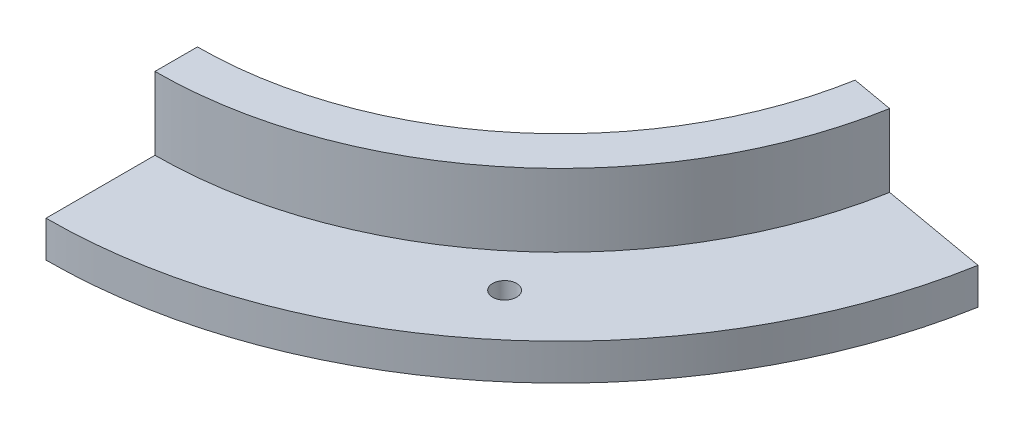
ISO-10303-21;
HEADER;
FILE_DESCRIPTION(('STEP AP214'),'2;1');
FILE_NAME('part.step','',(''),(''),'','','');
FILE_SCHEMA(('AUTOMOTIVE_DESIGN { 1 0 10303 214 1 1 1 1 }'));
ENDSEC;
DATA;
#1=APPLICATION_CONTEXT('core data for automotive mechanical design processes');
#2=APPLICATION_PROTOCOL_DEFINITION('international standard','automotive_design',2000,#1);
#3=PRODUCT_CONTEXT('',#1,'mechanical');
#4=PRODUCT('Part','Part','',(#3));
#5=PRODUCT_RELATED_PRODUCT_CATEGORY('part','',(#4));
#6=PRODUCT_DEFINITION_FORMATION('','',#4);
#7=PRODUCT_DEFINITION_CONTEXT('part definition',#1,'design');
#8=PRODUCT_DEFINITION('design','',#6,#7);
#9=PRODUCT_DEFINITION_SHAPE('','',#8);
#10=(LENGTH_UNIT() NAMED_UNIT(*) SI_UNIT(.MILLI.,.METRE.));
#11=(NAMED_UNIT(*) PLANE_ANGLE_UNIT() SI_UNIT($,.RADIAN.));
#12=(NAMED_UNIT(*) SI_UNIT($,.STERADIAN.) SOLID_ANGLE_UNIT());
#13=UNCERTAINTY_MEASURE_WITH_UNIT(LENGTH_MEASURE(1.E-05),#10,'distance_accuracy_value','');
#14=(GEOMETRIC_REPRESENTATION_CONTEXT(3) GLOBAL_UNCERTAINTY_ASSIGNED_CONTEXT((#13)) GLOBAL_UNIT_ASSIGNED_CONTEXT((#10,
#11,#12)) REPRESENTATION_CONTEXT('',''));
#15=CARTESIAN_POINT('',(0.,0.,0.));
#16=DIRECTION('',(0.,0.,1.));
#17=DIRECTION('',(1.,0.,0.));
#18=AXIS2_PLACEMENT_3D('',#15,#16,#17);
#19=CARTESIAN_POINT('',(0.,20.,0.));
#20=DIRECTION('',(0.,-1.,0.));
#21=DIRECTION('',(0.,0.,-1.));
#22=AXIS2_PLACEMENT_3D('',#19,#20,#21);
#23=CYLINDRICAL_SURFACE('',#22,141.7);
#24=CARTESIAN_POINT('',(0.,10.,0.));
#25=DIRECTION('',(0.,1.,0.));
#26=DIRECTION('',(0.,0.,1.));
#27=AXIS2_PLACEMENT_3D('',#24,#25,#26);
#28=CIRCLE('',#27,141.7);
#29=CARTESIAN_POINT('',(0.,10.,141.7));
#30=VERTEX_POINT('',#29);
#31=CARTESIAN_POINT('',(139.54725860183,10.,24.6059467754036));
#32=VERTEX_POINT('',#31);
#33=EDGE_CURVE('E121',#30,#32,#28,.T.);
#34=ORIENTED_EDGE('',*,*,#33,.F.);
#35=DIRECTION('',(0.,-1.,0.));
#36=VECTOR('',#35,1.);
#37=CARTESIAN_POINT('',(0.,20.,141.7));
#38=LINE('',#37,#36);
#39=CARTESIAN_POINT('',(0.,0.,141.7));
#40=VERTEX_POINT('',#39);
#41=EDGE_CURVE('E52',#30,#40,#38,.T.);
#42=ORIENTED_EDGE('',*,*,#41,.T.);
#43=CARTESIAN_POINT('',(0.,0.,0.));
#44=DIRECTION('',(0.,1.,0.));
#45=DIRECTION('',(0.,0.,1.));
#46=AXIS2_PLACEMENT_3D('',#43,#44,#45);
#47=CIRCLE('',#46,141.7);
#48=CARTESIAN_POINT('',(139.54725860183,0.,24.6059467754036));
#49=VERTEX_POINT('',#48);
#50=EDGE_CURVE('E143',#40,#49,#47,.T.);
#51=ORIENTED_EDGE('',*,*,#50,.T.);
#52=DIRECTION('',(0.,-1.,0.));
#53=VECTOR('',#52,1.);
#54=CARTESIAN_POINT('',(139.54725860183,20.,24.6059467754036));
#55=LINE('',#54,#53);
#56=EDGE_CURVE('E137',#32,#49,#55,.T.);
#57=ORIENTED_EDGE('',*,*,#56,.F.);
#58=EDGE_LOOP('',(#34,#42,#51,#57));
#59=FACE_BOUND('',#58,.T.);
#60=ADVANCED_FACE('F43',(#59),#23,.T.);
#61=CARTESIAN_POINT('',(0.,20.,0.));
#62=DIRECTION('',(0.,1.,0.));
#63=DIRECTION('',(0.,0.,1.));
#64=AXIS2_PLACEMENT_3D('',#61,#62,#63);
#65=PLANE('',#64);
#66=CARTESIAN_POINT('',(0.,20.,0.));
#67=DIRECTION('',(0.,-1.,0.));
#68=DIRECTION('',(0.,0.,1.));
#69=AXIS2_PLACEMENT_3D('',#66,#67,#68);
#70=CIRCLE('',#69,100.);
#71=CARTESIAN_POINT('',(98.4807753012209,20.,17.3648177666927));
#72=VERTEX_POINT('',#71);
#73=CARTESIAN_POINT('',(0.,20.,100.));
#74=VERTEX_POINT('',#73);
#75=EDGE_CURVE('E67',#72,#74,#70,.T.);
#76=ORIENTED_EDGE('',*,*,#75,.F.);
#77=DIRECTION('',(-0.984807753012209,0.,-0.173648177666927));
#78=VECTOR('',#77,1.);
#79=CARTESIAN_POINT('',(90.3068709512195,20.,15.9235378920572));
#80=LINE('',#79,#78);
#81=CARTESIAN_POINT('',(90.3068709512195,20.,15.9235378920572));
#82=VERTEX_POINT('',#81);
#83=EDGE_CURVE('E188',#72,#82,#80,.T.);
#84=ORIENTED_EDGE('',*,*,#83,.T.);
#85=CARTESIAN_POINT('',(0.,20.,0.));
#86=DIRECTION('',(0.,-1.,0.));
#87=DIRECTION('',(0.,0.,1.));
#88=AXIS2_PLACEMENT_3D('',#85,#86,#87);
#89=CIRCLE('',#88,91.7);
#90=CARTESIAN_POINT('',(66.2525360181307,20.,63.3994595494812));
#91=VERTEX_POINT('',#90);
#92=EDGE_CURVE('E185',#82,#91,#89,.T.);
#93=ORIENTED_EDGE('',*,*,#92,.T.);
#94=DIRECTION('',(-0.766044443118982,0.,0.642787609686535));
#95=VECTOR('',#94,1.);
#96=CARTESIAN_POINT('',(50.9316471557511,20.,76.2552117432119));
#97=LINE('',#96,#95);
#98=CARTESIAN_POINT('',(50.9316471557511,20.,76.2552117432119));
#99=VERTEX_POINT('',#98);
#100=EDGE_CURVE('E161',#91,#99,#97,.T.);
#101=ORIENTED_EDGE('',*,*,#100,.T.);
#102=CARTESIAN_POINT('',(0.,20.,0.));
#103=DIRECTION('',(0.,-1.,0.));
#104=DIRECTION('',(0.,0.,1.));
#105=AXIS2_PLACEMENT_3D('',#102,#103,#104);
#106=CIRCLE('',#105,91.7);
#107=CARTESIAN_POINT('',(0.,20.,91.7));
#108=VERTEX_POINT('',#107);
#109=EDGE_CURVE('E165',#99,#108,#106,.T.);
#110=ORIENTED_EDGE('',*,*,#109,.T.);
#111=DIRECTION('',(0.,0.,1.));
#112=VECTOR('',#111,1.);
#113=CARTESIAN_POINT('',(0.,20.,91.7));
#114=LINE('',#113,#112);
#115=EDGE_CURVE('E191',#108,#74,#114,.T.);
#116=ORIENTED_EDGE('',*,*,#115,.T.);
#117=EDGE_LOOP('',(#76,#84,#93,#101,#110,#116));
#118=FACE_BOUND('',#117,.T.);
#119=ADVANCED_FACE('F260',(#118),#65,.T.);
#120=CARTESIAN_POINT('',(0.,20.,0.));
#121=DIRECTION('',(0.,-1.,0.));
#122=DIRECTION('',(0.,0.,-1.));
#123=AXIS2_PLACEMENT_3D('',#120,#121,#122);
#124=CYLINDRICAL_SURFACE('',#123,91.7);
#125=CARTESIAN_POINT('',(0.,0.,0.));
#126=DIRECTION('',(0.,-1.,0.));
#127=DIRECTION('',(0.,0.,1.));
#128=AXIS2_PLACEMENT_3D('',#125,#126,#127);
#129=CIRCLE('',#128,91.7);
#130=CARTESIAN_POINT('',(50.9316471557511,0.,76.2552117432119));
#131=VERTEX_POINT('',#130);
#132=CARTESIAN_POINT('',(0.,0.,91.7));
#133=VERTEX_POINT('',#132);
#134=EDGE_CURVE('E178',#131,#133,#129,.T.);
#135=ORIENTED_EDGE('',*,*,#134,.T.);
#136=DIRECTION('',(0.,-1.,0.));
#137=VECTOR('',#136,1.);
#138=CARTESIAN_POINT('',(0.,20.,91.7));
#139=LINE('',#138,#137);
#140=EDGE_CURVE('E11',#108,#133,#139,.T.);
#141=ORIENTED_EDGE('',*,*,#140,.F.);
#142=ORIENTED_EDGE('',*,*,#109,.F.);
#143=DIRECTION('',(0.,-1.,0.));
#144=VECTOR('',#143,1.);
#145=CARTESIAN_POINT('',(50.9316471557511,20.,76.2552117432119));
#146=LINE('',#145,#144);
#147=EDGE_CURVE('E157',#99,#131,#146,.T.);
#148=ORIENTED_EDGE('',*,*,#147,.T.);
#149=EDGE_LOOP('',(#135,#141,#142,#148));
#150=FACE_BOUND('',#149,.T.);
#151=ADVANCED_FACE('F45',(#150),#124,.F.);
#152=CARTESIAN_POINT('',(0.,20.,91.7));
#153=DIRECTION('',(1.,0.,0.));
#154=DIRECTION('',(0.,0.,-1.));
#155=AXIS2_PLACEMENT_3D('',#152,#153,#154);
#156=PLANE('',#155);
#157=DIRECTION('',(0.,0.,1.));
#158=VECTOR('',#157,1.);
#159=CARTESIAN_POINT('',(0.,10.,141.7));
#160=LINE('',#159,#158);
#161=CARTESIAN_POINT('',(0.,10.,111.7));
#162=VERTEX_POINT('',#161);
#163=EDGE_CURVE('E127',#162,#30,#160,.T.);
#164=ORIENTED_EDGE('',*,*,#163,.F.);
#165=DIRECTION('',(0.,1.,0.));
#166=VECTOR('',#165,1.);
#167=CARTESIAN_POINT('',(0.,10.,111.7));
#168=LINE('',#167,#166);
#169=CARTESIAN_POINT('',(0.,30.,111.7));
#170=VERTEX_POINT('',#169);
#171=EDGE_CURVE('E222',#162,#170,#168,.T.);
#172=ORIENTED_EDGE('',*,*,#171,.T.);
#173=DIRECTION('',(0.,0.,1.));
#174=VECTOR('',#173,1.);
#175=CARTESIAN_POINT('',(0.,30.,100.));
#176=LINE('',#175,#174);
#177=CARTESIAN_POINT('',(0.,30.,100.));
#178=VERTEX_POINT('',#177);
#179=EDGE_CURVE('E211',#178,#170,#176,.T.);
#180=ORIENTED_EDGE('',*,*,#179,.F.);
#181=DIRECTION('',(0.,-1.,0.));
#182=VECTOR('',#181,1.);
#183=CARTESIAN_POINT('',(0.,30.,100.));
#184=LINE('',#183,#182);
#185=EDGE_CURVE('E182',#178,#74,#184,.T.);
#186=ORIENTED_EDGE('',*,*,#185,.T.);
#187=ORIENTED_EDGE('',*,*,#115,.F.);
#188=ORIENTED_EDGE('',*,*,#140,.T.);
#189=DIRECTION('',(0.,0.,1.));
#190=VECTOR('',#189,1.);
#191=CARTESIAN_POINT('',(0.,0.,91.7));
#192=LINE('',#191,#190);
#193=EDGE_CURVE('E174',#133,#40,#192,.T.);
#194=ORIENTED_EDGE('',*,*,#193,.T.);
#195=ORIENTED_EDGE('',*,*,#41,.F.);
#196=EDGE_LOOP('',(#164,#172,#180,#186,#187,#188,#194,#195));
#197=FACE_BOUND('',#196,.T.);
#198=ADVANCED_FACE('F268',(#197),#156,.F.);
#199=CARTESIAN_POINT('',(90.3068709512195,20.,15.9235378920572));
#200=DIRECTION('',(-0.173648177666927,0.,0.984807753012209));
#201=DIRECTION('',(0.984807753012209,0.,0.173648177666927));
#202=AXIS2_PLACEMENT_3D('',#199,#200,#201);
#203=PLANE('',#202);
#204=DIRECTION('',(-0.984807753012209,0.,-0.173648177666927));
#205=VECTOR('',#204,1.);
#206=CARTESIAN_POINT('',(98.4807753012209,30.,17.3648177666927));
#207=LINE('',#206,#205);
#208=CARTESIAN_POINT('',(110.003026011464,30.,19.3965014453958));
#209=VERTEX_POINT('',#208);
#210=CARTESIAN_POINT('',(98.4807753012209,30.,17.3648177666927));
#211=VERTEX_POINT('',#210);
#212=EDGE_CURVE('E204',#209,#211,#207,.T.);
#213=ORIENTED_EDGE('',*,*,#212,.F.);
#214=DIRECTION('',(0.,1.,0.));
#215=VECTOR('',#214,1.);
#216=CARTESIAN_POINT('',(110.003026011464,10.,19.3965014453958));
#217=LINE('',#216,#215);
#218=CARTESIAN_POINT('',(110.003026011464,10.,19.3965014453958));
#219=VERTEX_POINT('',#218);
#220=EDGE_CURVE('E59',#219,#209,#217,.T.);
#221=ORIENTED_EDGE('',*,*,#220,.F.);
#222=DIRECTION('',(-0.984807753012208,0.,-0.173648177666927));
#223=VECTOR('',#222,1.);
#224=CARTESIAN_POINT('',(139.54725860183,10.,24.6059467754036));
#225=LINE('',#224,#223);
#226=EDGE_CURVE('E125',#32,#219,#225,.T.);
#227=ORIENTED_EDGE('',*,*,#226,.F.);
#228=ORIENTED_EDGE('',*,*,#56,.T.);
#229=DIRECTION('',(-0.984807753012209,0.,-0.173648177666927));
#230=VECTOR('',#229,1.);
#231=CARTESIAN_POINT('',(90.3068709512195,0.,15.9235378920572));
#232=LINE('',#231,#230);
#233=CARTESIAN_POINT('',(90.3068709512195,0.,15.9235378920572));
#234=VERTEX_POINT('',#233);
#235=EDGE_CURVE('E169',#49,#234,#232,.T.);
#236=ORIENTED_EDGE('',*,*,#235,.T.);
#237=DIRECTION('',(0.,-1.,0.));
#238=VECTOR('',#237,1.);
#239=CARTESIAN_POINT('',(90.3068709512195,20.,15.9235378920572));
#240=LINE('',#239,#238);
#241=EDGE_CURVE('E146',#82,#234,#240,.T.);
#242=ORIENTED_EDGE('',*,*,#241,.F.);
#243=ORIENTED_EDGE('',*,*,#83,.F.);
#244=DIRECTION('',(0.,-1.,0.));
#245=VECTOR('',#244,1.);
#246=CARTESIAN_POINT('',(98.4807753012209,30.,17.3648177666927));
#247=LINE('',#246,#245);
#248=EDGE_CURVE('E200',#211,#72,#247,.T.);
#249=ORIENTED_EDGE('',*,*,#248,.F.);
#250=EDGE_LOOP('',(#213,#221,#227,#228,#236,#242,#243,#249));
#251=FACE_BOUND('',#250,.T.);
#252=ADVANCED_FACE('F136',(#251),#203,.F.);
#253=CARTESIAN_POINT('',(0.,20.,0.));
#254=DIRECTION('',(0.,-1.,0.));
#255=DIRECTION('',(0.,0.,-1.));
#256=AXIS2_PLACEMENT_3D('',#253,#254,#255);
#257=CYLINDRICAL_SURFACE('',#256,91.7);
#258=CARTESIAN_POINT('',(0.,0.,0.));
#259=DIRECTION('',(0.,-1.,0.));
#260=DIRECTION('',(0.,0.,1.));
#261=AXIS2_PLACEMENT_3D('',#258,#259,#260);
#262=CIRCLE('',#261,91.7);
#263=CARTESIAN_POINT('',(66.2525360181307,0.,63.3994595494812));
#264=VERTEX_POINT('',#263);
#265=EDGE_CURVE('E166',#234,#264,#262,.T.);
#266=ORIENTED_EDGE('',*,*,#265,.T.);
#267=DIRECTION('',(0.,-1.,0.));
#268=VECTOR('',#267,1.);
#269=CARTESIAN_POINT('',(66.2525360181307,20.,63.3994595494812));
#270=LINE('',#269,#268);
#271=EDGE_CURVE('E151',#91,#264,#270,.T.);
#272=ORIENTED_EDGE('',*,*,#271,.F.);
#273=ORIENTED_EDGE('',*,*,#92,.F.);
#274=ORIENTED_EDGE('',*,*,#241,.T.);
#275=EDGE_LOOP('',(#266,#272,#273,#274));
#276=FACE_BOUND('',#275,.T.);
#277=ADVANCED_FACE('F275',(#276),#257,.F.);
#278=CARTESIAN_POINT('',(50.9316471557511,20.,76.2552117432119));
#279=DIRECTION('',(0.642787609686535,0.,0.766044443118982));
#280=DIRECTION('',(0.766044443118982,0.,-0.642787609686535));
#281=AXIS2_PLACEMENT_3D('',#278,#279,#280);
#282=PLANE('',#281);
#283=CARTESIAN_POINT('',(58.5920915869409,10.,69.8273356463466));
#284=DIRECTION('',(-0.642787609686535,0.,-0.766044443118982));
#285=DIRECTION('',(-0.766044443118982,0.,0.642787609686535));
#286=AXIS2_PLACEMENT_3D('',#283,#284,#285);
#287=CIRCLE('',#286,2.8);
#288=CARTESIAN_POINT('',(56.4471671462078,10.,71.6271409534689));
#289=VERTEX_POINT('',#288);
#290=EDGE_CURVE('E218',#289,#289,#287,.T.);
#291=ORIENTED_EDGE('',*,*,#290,.F.);
#292=EDGE_LOOP('',(#291));
#293=FACE_BOUND('',#292,.T.);
#294=DIRECTION('',(-0.766044443118982,0.,0.642787609686535));
#295=VECTOR('',#294,1.);
#296=CARTESIAN_POINT('',(50.9316471557511,0.,76.2552117432119));
#297=LINE('',#296,#295);
#298=EDGE_CURVE('E162',#264,#131,#297,.T.);
#299=ORIENTED_EDGE('',*,*,#298,.T.);
#300=ORIENTED_EDGE('',*,*,#147,.F.);
#301=ORIENTED_EDGE('',*,*,#100,.F.);
#302=ORIENTED_EDGE('',*,*,#271,.T.);
#303=EDGE_LOOP('',(#299,#300,#301,#302));
#304=FACE_BOUND('',#303,.T.);
#305=ADVANCED_FACE('F298',(#293,#304),#282,.F.);
#306=CARTESIAN_POINT('',(0.,0.,0.));
#307=DIRECTION('',(0.,1.,0.));
#308=DIRECTION('',(0.,0.,1.));
#309=AXIS2_PLACEMENT_3D('',#306,#307,#308);
#310=PLANE('',#309);
#311=CARTESIAN_POINT('',(80.3484512108169,0.,95.7555553898727));
#312=DIRECTION('',(0.,1.,0.));
#313=DIRECTION('',(0.,0.,1.));
#314=AXIS2_PLACEMENT_3D('',#311,#312,#313);
#315=CIRCLE('',#314,3.3);
#316=CARTESIAN_POINT('',(80.3484512108169,0.,99.0555553898727));
#317=VERTEX_POINT('',#316);
#318=EDGE_CURVE('E233',#317,#317,#315,.T.);
#319=ORIENTED_EDGE('',*,*,#318,.T.);
#320=EDGE_LOOP('',(#319));
#321=FACE_BOUND('',#320,.T.);
#322=ORIENTED_EDGE('',*,*,#134,.F.);
#323=ORIENTED_EDGE('',*,*,#298,.F.);
#324=ORIENTED_EDGE('',*,*,#265,.F.);
#325=ORIENTED_EDGE('',*,*,#235,.F.);
#326=ORIENTED_EDGE('',*,*,#50,.F.);
#327=ORIENTED_EDGE('',*,*,#193,.F.);
#328=EDGE_LOOP('',(#322,#323,#324,#325,#326,#327));
#329=FACE_BOUND('',#328,.T.);
#330=ADVANCED_FACE('F280',(#321,#329),#310,.F.);
#331=CARTESIAN_POINT('',(0.,30.,0.));
#332=DIRECTION('',(0.,-1.,0.));
#333=DIRECTION('',(0.,0.,-1.));
#334=AXIS2_PLACEMENT_3D('',#331,#332,#333);
#335=CYLINDRICAL_SURFACE('',#334,100.);
#336=ORIENTED_EDGE('',*,*,#75,.T.);
#337=ORIENTED_EDGE('',*,*,#185,.F.);
#338=CARTESIAN_POINT('',(0.,30.,0.));
#339=DIRECTION('',(0.,-1.,0.));
#340=DIRECTION('',(0.,0.,1.));
#341=AXIS2_PLACEMENT_3D('',#338,#339,#340);
#342=CIRCLE('',#341,100.);
#343=EDGE_CURVE('E207',#211,#178,#342,.T.);
#344=ORIENTED_EDGE('',*,*,#343,.F.);
#345=ORIENTED_EDGE('',*,*,#248,.T.);
#346=EDGE_LOOP('',(#336,#337,#344,#345));
#347=FACE_BOUND('',#346,.T.);
#348=ADVANCED_FACE('F292',(#347),#335,.F.);
#349=CARTESIAN_POINT('',(0.,30.,0.));
#350=DIRECTION('',(0.,1.,0.));
#351=DIRECTION('',(0.,0.,1.));
#352=AXIS2_PLACEMENT_3D('',#349,#350,#351);
#353=PLANE('',#352);
#354=CARTESIAN_POINT('',(0.,30.,0.));
#355=DIRECTION('',(0.,-1.,0.));
#356=DIRECTION('',(0.,0.,1.));
#357=AXIS2_PLACEMENT_3D('',#354,#355,#356);
#358=CIRCLE('',#357,111.7);
#359=EDGE_CURVE('E132',#209,#170,#358,.T.);
#360=ORIENTED_EDGE('',*,*,#359,.F.);
#361=ORIENTED_EDGE('',*,*,#212,.T.);
#362=ORIENTED_EDGE('',*,*,#343,.T.);
#363=ORIENTED_EDGE('',*,*,#179,.T.);
#364=EDGE_LOOP('',(#360,#361,#362,#363));
#365=FACE_BOUND('',#364,.T.);
#366=ADVANCED_FACE('F295',(#365),#353,.T.);
#367=CARTESIAN_POINT('',(60.3918968940632,10.,71.9722600870797));
#368=DIRECTION('',(-0.642787609686535,0.,-0.766044443118982));
#369=DIRECTION('',(-0.766044443118982,0.,0.642787609686535));
#370=AXIS2_PLACEMENT_3D('',#367,#368,#369);
#371=CYLINDRICAL_SURFACE('',#370,2.8);
#372=CARTESIAN_POINT('',(60.3918968940632,10.,71.9722600870797));
#373=DIRECTION('',(-0.642787609686535,0.,-0.766044443118982));
#374=DIRECTION('',(-0.766044443118982,0.,0.642787609686535));
#375=AXIS2_PLACEMENT_3D('',#372,#373,#374);
#376=CIRCLE('',#375,2.8);
#377=CARTESIAN_POINT('',(58.2469724533301,10.,73.772065394202));
#378=VERTEX_POINT('',#377);
#379=EDGE_CURVE('E208',#378,#378,#376,.T.);
#380=ORIENTED_EDGE('',*,*,#379,.F.);
#381=EDGE_LOOP('',(#380));
#382=FACE_BOUND('',#381,.T.);
#383=ORIENTED_EDGE('',*,*,#290,.T.);
#384=EDGE_LOOP('',(#383));
#385=FACE_BOUND('',#384,.T.);
#386=ADVANCED_FACE('F314',(#382,#385),#371,.F.);
#387=CARTESIAN_POINT('',(60.3918968940632,10.,71.9722600870797));
#388=DIRECTION('',(-0.642787609686535,0.,-0.766044443118982));
#389=DIRECTION('',(-0.766044443118982,0.,0.642787609686535));
#390=AXIS2_PLACEMENT_3D('',#387,#388,#389);
#391=PLANE('',#390);
#392=ORIENTED_EDGE('',*,*,#379,.T.);
#393=EDGE_LOOP('',(#392));
#394=FACE_BOUND('',#393,.T.);
#395=ADVANCED_FACE('F257',(#394),#391,.T.);
#396=CARTESIAN_POINT('',(0.,10.,0.));
#397=DIRECTION('',(0.,1.,0.));
#398=DIRECTION('',(0.,0.,1.));
#399=AXIS2_PLACEMENT_3D('',#396,#397,#398);
#400=CYLINDRICAL_SURFACE('',#399,111.7);
#401=ORIENTED_EDGE('',*,*,#359,.T.);
#402=ORIENTED_EDGE('',*,*,#171,.F.);
#403=CARTESIAN_POINT('',(0.,10.,0.));
#404=DIRECTION('',(0.,-1.,0.));
#405=DIRECTION('',(0.,0.,1.));
#406=AXIS2_PLACEMENT_3D('',#403,#404,#405);
#407=CIRCLE('',#406,111.7);
#408=EDGE_CURVE('E140',#219,#162,#407,.T.);
#409=ORIENTED_EDGE('',*,*,#408,.F.);
#410=ORIENTED_EDGE('',*,*,#220,.T.);
#411=EDGE_LOOP('',(#401,#402,#409,#410));
#412=FACE_BOUND('',#411,.T.);
#413=ADVANCED_FACE('F249',(#412),#400,.T.);
#414=CARTESIAN_POINT('',(0.,10.,0.));
#415=DIRECTION('',(0.,1.,0.));
#416=DIRECTION('',(0.,0.,1.));
#417=AXIS2_PLACEMENT_3D('',#414,#415,#416);
#418=PLANE('',#417);
#419=CARTESIAN_POINT('',(80.3484512108169,9.99999999999999,95.7555553898727));
#420=DIRECTION('',(0.,1.,0.));
#421=DIRECTION('',(0.,0.,1.));
#422=AXIS2_PLACEMENT_3D('',#419,#420,#421);
#423=CIRCLE('',#422,3.29999999999998);
#424=CARTESIAN_POINT('',(80.3484512108169,9.99999999999999,99.0555553898727));
#425=VERTEX_POINT('',#424);
#426=EDGE_CURVE('E241',#425,#425,#423,.T.);
#427=ORIENTED_EDGE('',*,*,#426,.F.);
#428=EDGE_LOOP('',(#427));
#429=FACE_BOUND('',#428,.T.);
#430=ORIENTED_EDGE('',*,*,#33,.T.);
#431=ORIENTED_EDGE('',*,*,#226,.T.);
#432=ORIENTED_EDGE('',*,*,#408,.T.);
#433=ORIENTED_EDGE('',*,*,#163,.T.);
#434=EDGE_LOOP('',(#430,#431,#432,#433));
#435=FACE_BOUND('',#434,.T.);
#436=ADVANCED_FACE('F123',(#429,#435),#418,.T.);
#437=CARTESIAN_POINT('',(80.3484512108169,9.99999999999999,95.7555553898727));
#438=DIRECTION('',(0.,1.,0.));
#439=DIRECTION('',(0.,0.,1.));
#440=AXIS2_PLACEMENT_3D('',#437,#438,#439);
#441=CYLINDRICAL_SURFACE('',#440,3.29999999999999);
#442=ORIENTED_EDGE('',*,*,#318,.F.);
#443=EDGE_LOOP('',(#442));
#444=FACE_BOUND('',#443,.T.);
#445=ORIENTED_EDGE('',*,*,#426,.T.);
#446=EDGE_LOOP('',(#445));
#447=FACE_BOUND('',#446,.T.);
#448=ADVANCED_FACE('F246',(#444,#447),#441,.F.);
#449=CLOSED_SHELL('',(#60,#119,#151,#198,#252,#277,#305,#330,#348,#366,#386,#395,#413,#436,#448));
#450=MANIFOLD_SOLID_BREP('B2',#449);
#451=ADVANCED_BREP_SHAPE_REPRESENTATION('',(#18,#450),#14);
#452=SHAPE_DEFINITION_REPRESENTATION(#9,#451);
ENDSEC;
END-ISO-10303-21;
